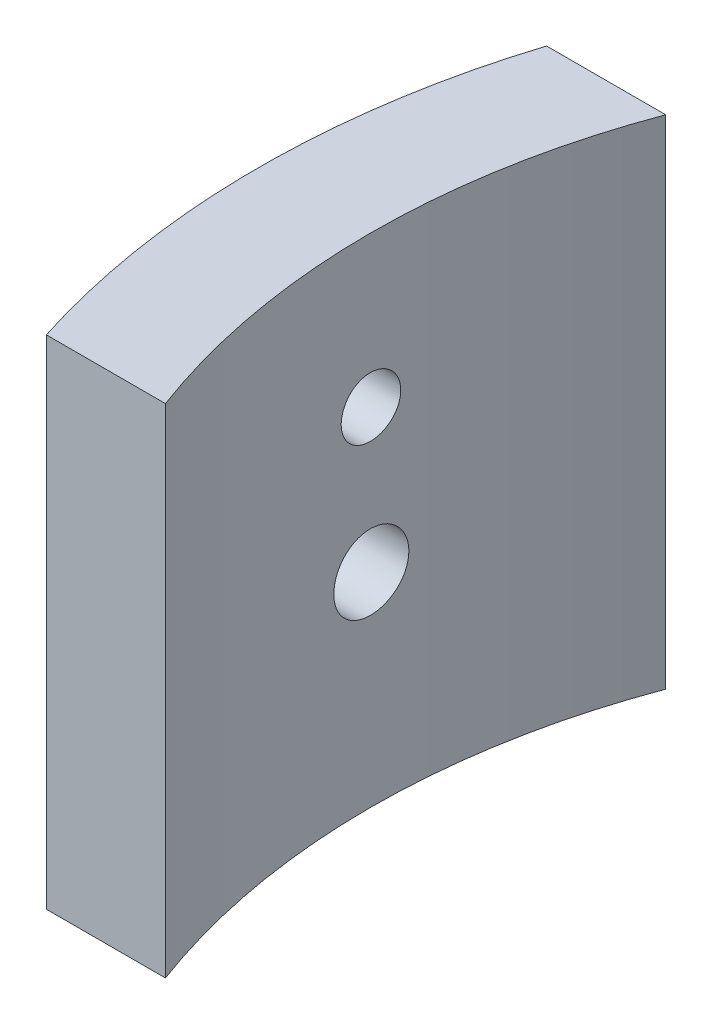
ISO-10303-21;
HEADER;
FILE_DESCRIPTION(('STEP AP214'),'2;1');
FILE_NAME('part.step','',(''),(''),'','','');
FILE_SCHEMA(('AUTOMOTIVE_DESIGN { 1 0 10303 214 1 1 1 1 }'));
ENDSEC;
DATA;
#1=APPLICATION_CONTEXT('core data for automotive mechanical design processes');
#2=APPLICATION_PROTOCOL_DEFINITION('international standard','automotive_design',2000,#1);
#3=PRODUCT_CONTEXT('',#1,'mechanical');
#4=PRODUCT('Part','Part','',(#3));
#5=PRODUCT_RELATED_PRODUCT_CATEGORY('part','',(#4));
#6=PRODUCT_DEFINITION_FORMATION('','',#4);
#7=PRODUCT_DEFINITION_CONTEXT('part definition',#1,'design');
#8=PRODUCT_DEFINITION('design','',#6,#7);
#9=PRODUCT_DEFINITION_SHAPE('','',#8);
#10=(LENGTH_UNIT() NAMED_UNIT(*) SI_UNIT(.MILLI.,.METRE.));
#11=(NAMED_UNIT(*) PLANE_ANGLE_UNIT() SI_UNIT($,.RADIAN.));
#12=(NAMED_UNIT(*) SI_UNIT($,.STERADIAN.) SOLID_ANGLE_UNIT());
#13=UNCERTAINTY_MEASURE_WITH_UNIT(LENGTH_MEASURE(1.E-05),#10,'distance_accuracy_value','');
#14=(GEOMETRIC_REPRESENTATION_CONTEXT(3) GLOBAL_UNCERTAINTY_ASSIGNED_CONTEXT((#13)) GLOBAL_UNIT_ASSIGNED_CONTEXT((#10,
#11,#12)) REPRESENTATION_CONTEXT('',''));
#15=CARTESIAN_POINT('',(0.,0.,0.));
#16=DIRECTION('',(0.,0.,1.));
#17=DIRECTION('',(1.,0.,0.));
#18=AXIS2_PLACEMENT_3D('',#15,#16,#17);
#19=CARTESIAN_POINT('',(0.,38.1,0.));
#20=DIRECTION('',(0.,-1.,0.));
#21=DIRECTION('',(0.,0.,-1.));
#22=AXIS2_PLACEMENT_3D('',#19,#20,#21);
#23=CYLINDRICAL_SURFACE('',#22,44.1043940806668);
#24=CARTESIAN_POINT('',(-44.0590237888081,22.4503977043266,-2.));
#25=CARTESIAN_POINT('',(-44.0590243990417,22.3381188090999,-1.99999504026224));
#26=CARTESIAN_POINT('',(-44.059457594174,22.2257599712269,-1.99051333666365));
#27=CARTESIAN_POINT('',(-44.0611439035289,22.0041409690323,-1.95282289828939));
#28=CARTESIAN_POINT('',(-44.0623979874924,21.8948846292606,-1.92459201395395));
#29=CARTESIAN_POINT('',(-44.0655837261527,21.6827131257266,-1.85021234894222));
#30=CARTESIAN_POINT('',(-44.0675150392582,21.5797947958113,-1.80407260016147));
#31=CARTESIAN_POINT('',(-44.07183718338,21.383192230565,-1.69519856298965));
#32=CARTESIAN_POINT('',(-44.0742279048652,21.2895058022224,-1.63246822875086));
#33=CARTESIAN_POINT('',(-44.0792018313536,21.1139179094863,-1.49213328396865));
#34=CARTESIAN_POINT('',(-44.081785178842,21.0320253028854,-1.41451759468417));
#35=CARTESIAN_POINT('',(-44.0868519077452,20.8824250479504,-1.24663689081444));
#36=CARTESIAN_POINT('',(-44.0893352851041,20.8147179746819,-1.15637136366641));
#37=CARTESIAN_POINT('',(-44.0939232379155,20.695387996913,-0.965709017333088));
#38=CARTESIAN_POINT('',(-44.0960276565927,20.643771742765,-0.865308031786972));
#39=CARTESIAN_POINT('',(-44.0996191363418,20.5581313546115,-0.657254173700705));
#40=CARTESIAN_POINT('',(-44.101106201476,20.5241071048492,-0.549601348883508));
#41=CARTESIAN_POINT('',(-44.103294457514,20.4746392636337,-0.33017890448785));
#42=CARTESIAN_POINT('',(-44.1039961934411,20.4591827854867,-0.21841219567996));
#43=CARTESIAN_POINT('',(-44.1045365332244,20.4472494824255,0.00613148555656997));
#44=CARTESIAN_POINT('',(-44.1043751429451,20.4507725285546,0.118908451115803));
#45=CARTESIAN_POINT('',(-44.1032078790649,20.4766875432299,0.342184063937902));
#46=CARTESIAN_POINT('',(-44.1022026265039,20.4990656354592,0.452684325483995));
#47=CARTESIAN_POINT('',(-44.0994616007306,20.5620340090446,0.668358242295614));
#48=CARTESIAN_POINT('',(-44.0977258248567,20.6026243567578,0.773531878151817));
#49=CARTESIAN_POINT('',(-44.0937182355526,20.7008808827919,0.975611752615507));
#50=CARTESIAN_POINT('',(-44.091446223388,20.7585533939594,1.07251490792658));
#51=CARTESIAN_POINT('',(-44.0866220771742,20.8893324984076,1.2552693773662));
#52=CARTESIAN_POINT('',(-44.0840699415177,20.9624391802526,1.34112062807221));
#53=CARTESIAN_POINT('',(-44.0789703028674,21.1220898667769,1.49941519997886));
#54=CARTESIAN_POINT('',(-44.0764228061129,21.2086459095705,1.57184638069112));
#55=CARTESIAN_POINT('',(-44.0716219560926,21.3926959778935,1.70115125204406));
#56=CARTESIAN_POINT('',(-44.0693686028951,21.4901900059653,1.75802493906852));
#57=CARTESIAN_POINT('',(-44.0654103171441,21.6933557433338,1.85459926051977));
#58=CARTESIAN_POINT('',(-44.0637053986152,21.7990276616728,1.89429945578845));
#59=CARTESIAN_POINT('',(-44.0610367907876,22.0155462965671,1.95539182542674));
#60=CARTESIAN_POINT('',(-44.0600730969019,22.1263929810957,1.9767841130885));
#61=CARTESIAN_POINT('',(-44.0589964552785,22.3500088997396,2.00063843719291));
#62=CARTESIAN_POINT('',(-44.0588827506357,22.4627763337251,2.00311731583438));
#63=CARTESIAN_POINT('',(-44.059516933974,22.687125609486,1.9891183904386));
#64=CARTESIAN_POINT('',(-44.0602648196199,22.7987074544738,1.97264063777987));
#65=CARTESIAN_POINT('',(-44.062537194939,23.0174709353795,1.92121015543386));
#66=CARTESIAN_POINT('',(-44.0640613611927,23.1246543837092,1.88626511948829));
#67=CARTESIAN_POINT('',(-44.0677142267263,23.3316343139471,1.79889981954337));
#68=CARTESIAN_POINT('',(-44.0698429288743,23.4314307608047,1.7464794726317));
#69=CARTESIAN_POINT('',(-44.0744667739158,23.6208813488044,1.62560829191931));
#70=CARTESIAN_POINT('',(-44.0769621751523,23.7105282600176,1.5571461361259));
#71=CARTESIAN_POINT('',(-44.082037236522,23.877062333708,1.40615128962696));
#72=CARTESIAN_POINT('',(-44.0846168971038,23.9539494282295,1.32361852398954));
#73=CARTESIAN_POINT('',(-44.0895719198985,24.0928378223479,1.14675297379224));
#74=CARTESIAN_POINT('',(-44.0919471320754,24.1548282487014,1.05241164595836));
#75=CARTESIAN_POINT('',(-44.0962234115755,24.2620893052479,0.854650245895033));
#76=CARTESIAN_POINT('',(-44.0981244806878,24.3073599985366,0.751230207927943));
#77=CARTESIAN_POINT('',(-44.1012374923982,24.3798774816934,0.538287702199877));
#78=CARTESIAN_POINT('',(-44.1024497018401,24.4071312514542,0.428767615493967));
#79=CARTESIAN_POINT('',(-44.1040494306891,24.4428641173537,0.206700459798727));
#80=CARTESIAN_POINT('',(-44.1044369536586,24.4513432945917,0.0941534038869088));
#81=CARTESIAN_POINT('',(-44.1043436513105,24.4492854762555,-0.130664836209696));
#82=CARTESIAN_POINT('',(-44.1038636055085,24.438765551491,-0.242936177373259));
#83=CARTESIAN_POINT('',(-44.1020907543579,24.3990434008602,-0.464117113927691));
#84=CARTESIAN_POINT('',(-44.1007979474527,24.3698411392127,-0.57302670287954));
#85=CARTESIAN_POINT('',(-44.097545068798,24.2935865821962,-0.784396620558011));
#86=CARTESIAN_POINT('',(-44.0955849899102,24.246534095867,-0.886856880276511));
#87=CARTESIAN_POINT('',(-44.0912181191504,24.1359180591273,-1.08242377536315));
#88=CARTESIAN_POINT('',(-44.0888113416667,24.0723550404986,-1.17553071185518));
#89=CARTESIAN_POINT('',(-44.0838196151823,23.9304624413345,-1.34983244348865));
#90=CARTESIAN_POINT('',(-44.081234526927,23.8521212347809,-1.43101776984483));
#91=CARTESIAN_POINT('',(-44.0761783607003,23.6828985642765,-1.57910878244087));
#92=CARTESIAN_POINT('',(-44.0737073109857,23.5920140143324,-1.64601094429745));
#93=CARTESIAN_POINT('',(-44.0691564797967,23.4002230850397,-1.76366230597344));
#94=CARTESIAN_POINT('',(-44.067077041602,23.299308030403,-1.81439736069738));
#95=CARTESIAN_POINT('',(-44.0635495597143,23.0904589145261,-1.8981440618847));
#96=CARTESIAN_POINT('',(-44.0621007686351,22.9825333368893,-1.93117669845201));
#97=CARTESIAN_POINT('',(-44.0603825821113,22.8033446641878,-1.96989147622607));
#98=CARTESIAN_POINT('',(-44.0598752725266,22.7332429141104,-1.9811678156445));
#99=CARTESIAN_POINT('',(-44.0591956832243,22.592237313413,-1.9962236416578));
#100=CARTESIAN_POINT('',(-44.0590234032736,22.5213334633516,-2.0000031334719));
#101=CARTESIAN_POINT('',(-44.0590237888081,22.4503977043266,-2.));
#102=B_SPLINE_CURVE_WITH_KNOTS('',3,(#24,#25,#26,#27,#28,#29,#30,#31,#32,#33,#34,#35,#36,#37,
#38,#39,#40,#41,#42,#43,#44,#45,#46,#47,#48,#49,#50,#51,#52,#53,#54,#55,#56,#57,#58,#59,#60,#61,
#62,#63,#64,#65,#66,#67,#68,#69,#70,#71,#72,#73,#74,#75,#76,#77,#78,#79,#80,#81,#82,#83,#84,#85,
#86,#87,#88,#89,#90,#91,#92,#93,#94,#95,#96,#97,#98,#99,#100,#101),.UNSPECIFIED.,.T.,.F.,(4,2,2,
2,2,2,2,2,2,2,2,2,2,2,2,2,2,2,2,2,2,2,2,2,2,2,2,2,2,2,2,2,2,2,2,2,2,2,4),(0.,0.336577747932862,
0.67355382481844,1.01036017645689,1.34708632686833,1.68406407233082,2.02105547585109,
2.35818597417798,2.69531425413082,3.03220841963958,3.36910029611725,3.70574445432932,
4.04238983912761,4.37916018454449,4.71593246246813,5.05300793010627,5.39008347609496,
5.72716764122258,6.06424972040629,6.40103159634617,6.73781255950191,7.0744533252401,
7.41109568820666,7.74797636621007,8.08485883830001,8.42198646279997,8.75911281506109,
9.09610848536475,9.43310269996922,9.76979427383375,10.1064864925492,10.4431823132749,
10.7798672908313,11.1168182519089,11.4538522600797,11.7911803450558,12.1281075635474,
12.3407513965148,12.5533950814416),.UNSPECIFIED.);
#103=CARTESIAN_POINT('',(-44.0590237888081,22.4503977043266,-2.));
#104=VERTEX_POINT('',#103);
#105=EDGE_CURVE('E134',#104,#104,#102,.T.);
#106=ORIENTED_EDGE('',*,*,#105,.F.);
#107=EDGE_LOOP('',(#106));
#108=FACE_BOUND('',#107,.T.);
#109=CARTESIAN_POINT('',(-43.8465069415199,30.0703977043267,-4.76250000000001));
#110=CARTESIAN_POINT('',(-43.8465065309564,29.9370150287803,-4.76250137530376));
#111=CARTESIAN_POINT('',(-43.8471168179167,29.8036530968397,-4.75689447266601));
#112=CARTESIAN_POINT('',(-43.8495397569245,29.5378360452066,-4.7345087160224));
#113=CARTESIAN_POINT('',(-43.8513527150719,29.4053811650472,-4.71772701784067));
#114=CARTESIAN_POINT('',(-43.8561315531644,29.1422686790484,-4.67309361852635));
#115=CARTESIAN_POINT('',(-43.8590983240271,29.0116125430267,-4.64523336270208));
#116=CARTESIAN_POINT('',(-43.8661007232562,28.7530801753742,-4.57863572826138));
#117=CARTESIAN_POINT('',(-43.8701367429708,28.6252049801565,-4.53989436681544));
#118=CARTESIAN_POINT('',(-43.8791570871768,28.3733167596648,-4.45186526115511));
#119=CARTESIAN_POINT('',(-43.8841404588819,28.2492999984162,-4.40258810701371));
#120=CARTESIAN_POINT('',(-43.8949182415999,28.0058214078066,-4.29379979539951));
#121=CARTESIAN_POINT('',(-43.9007129511288,27.8863612756469,-4.23428486928769));
#122=CARTESIAN_POINT('',(-43.9129441493275,27.6529463891225,-4.10549543647735));
#123=CARTESIAN_POINT('',(-43.9193802736525,27.5389885632662,-4.03622646127171));
#124=CARTESIAN_POINT('',(-43.9327178083424,27.3172582819339,-3.88836636631439));
#125=CARTESIAN_POINT('',(-43.9396193903087,27.2094881350918,-3.80977180027824));
#126=CARTESIAN_POINT('',(-43.9537152704963,27.000574262673,-3.64355169707933));
#127=CARTESIAN_POINT('',(-43.9609104809707,26.8994542169924,-3.55589647375968));
#128=CARTESIAN_POINT('',(-43.9753708796073,26.7049128368333,-3.3723593936946));
#129=CARTESIAN_POINT('',(-43.9826360926568,26.6114943623936,-3.27647450753875));
#130=CARTESIAN_POINT('',(-43.9970264194929,26.4330815033402,-3.07720892817069));
#131=CARTESIAN_POINT('',(-44.0041515775141,26.3480844235171,-2.97383065162746));
#132=CARTESIAN_POINT('',(-44.0180658698236,26.1870499056262,-2.76023810872376));
#133=CARTESIAN_POINT('',(-44.0248548791661,26.1110157847915,-2.65002133429486));
#134=CARTESIAN_POINT('',(-44.0379160898569,25.9683314347992,-2.42330874870627));
#135=CARTESIAN_POINT('',(-44.0441871811712,25.9017011545542,-2.30680029312634));
#136=CARTESIAN_POINT('',(-44.0560210596333,25.7784791364571,-2.06854161979116));
#137=CARTESIAN_POINT('',(-44.0615835834177,25.7218911281059,-1.94678947540698));
#138=CARTESIAN_POINT('',(-44.0769555718001,25.5679065931107,-1.57503550207831));
#139=CARTESIAN_POINT('',(-44.0854646561081,25.4861295931305,-1.31828152562882));
#140=CARTESIAN_POINT('',(-44.0979875908934,25.3672244982917,-0.795733386354938));
#141=CARTESIAN_POINT('',(-44.1020189278895,25.3299226765287,-0.529978596352507));
#142=CARTESIAN_POINT('',(-44.1052015505222,25.300401627345,0.00408472100752453));
#143=CARTESIAN_POINT('',(-44.1043529820606,25.3081810520641,0.27239317177512));
#144=CARTESIAN_POINT('',(-44.0978829888639,25.3684848881474,0.80272518197026));
#145=CARTESIAN_POINT('',(-44.0922814625503,25.4208227571155,1.06477026759159));
#146=CARTESIAN_POINT('',(-44.0769583895802,25.568460634289,1.57633798427704));
#147=CARTESIAN_POINT('',(-44.067236781878,25.6637612790588,1.82586042973673));
#148=CARTESIAN_POINT('',(-44.0447318585004,25.894823832352,2.30588154216014));
#149=CARTESIAN_POINT('',(-44.0319423482658,26.0306677411457,2.53634043427181));
#150=CARTESIAN_POINT('',(-44.0047355341011,26.3389006962968,2.97125943883504));
#151=CARTESIAN_POINT('',(-43.9903181744672,26.5112909934201,3.175718661089));
#152=CARTESIAN_POINT('',(-43.9613854476045,26.8887710586733,3.55392773642759));
#153=CARTESIAN_POINT('',(-43.9468699556355,27.0940231751736,3.72751558491278));
#154=CARTESIAN_POINT('',(-43.9194501089016,27.5308391547976,4.03779878551054));
#155=CARTESIAN_POINT('',(-43.906545757158,27.7624030672614,4.17449406844027));
#156=CARTESIAN_POINT('',(-43.8838085631316,28.245399750536,4.40711401205456));
#157=CARTESIAN_POINT('',(-43.8739765408893,28.4968378035863,4.5030277901407));
#158=CARTESIAN_POINT('',(-43.8585139364762,29.0123798742716,4.65122934231966));
#159=CARTESIAN_POINT('',(-43.8528832045198,29.276483439995,4.70351867173077));
#160=CARTESIAN_POINT('',(-43.8464871377051,29.8084348514969,4.76277681931969));
#161=CARTESIAN_POINT('',(-43.845697429279,30.0762571241172,4.76997267802839));
#162=CARTESIAN_POINT('',(-43.8490084674653,30.6092935394765,4.73943669964974));
#163=CARTESIAN_POINT('',(-43.8531091368011,30.874507723361,4.70170557248704));
#164=CARTESIAN_POINT('',(-43.8657166998315,31.3941322398574,4.58257700429528));
#165=CARTESIAN_POINT('',(-43.8742126821357,31.6485676463672,4.50128767895934));
#166=CARTESIAN_POINT('',(-43.8946447461755,32.1401929886849,4.2974607949564));
#167=CARTESIAN_POINT('',(-43.9065809193113,32.3773824660874,4.17492214034845));
#168=CARTESIAN_POINT('',(-43.9326072998264,32.8288156418182,3.89150963651744));
#169=CARTESIAN_POINT('',(-43.9467058556715,33.0429646870236,3.73048579868569));
#170=CARTESIAN_POINT('',(-43.9754414510301,33.4412764009661,3.37488695110257));
#171=CARTESIAN_POINT('',(-43.9900785060975,33.6254382027274,3.18031097164373));
#172=CARTESIAN_POINT('',(-44.0183159443298,33.9593353768408,2.76214771739266));
#173=CARTESIAN_POINT('',(-44.0319116962205,34.1089223185423,2.53844157777638));
#174=CARTESIAN_POINT('',(-44.0564663714723,34.3683991459452,2.06893927483715));
#175=CARTESIAN_POINT('',(-44.0674253361203,34.4782896532274,1.82314345747734));
#176=CARTESIAN_POINT('',(-44.0854521521882,34.6550096038396,1.31699979732673));
#177=CARTESIAN_POINT('',(-44.0925279958029,34.7219275415176,1.05668306788743));
#178=CARTESIAN_POINT('',(-44.1020194342149,34.8110727459242,0.52828144980144));
#179=CARTESIAN_POINT('',(-44.1044351832915,34.833301492156,0.26019681862097));
#180=CARTESIAN_POINT('',(-44.1043726378466,34.8326876008119,-0.140920832053926));
#181=CARTESIAN_POINT('',(-44.1037423916554,34.8268692204749,-0.274190444524194));
#182=CARTESIAN_POINT('',(-44.1012904097247,34.8040857010611,-0.539749015039673));
#183=CARTESIAN_POINT('',(-44.0994691166989,34.7871247037,-0.672038318996618));
#184=CARTESIAN_POINT('',(-44.0946834637565,34.7421671492332,-0.934747144404359));
#185=CARTESIAN_POINT('',(-44.0917186862589,34.714166560574,-1.06516596471962));
#186=CARTESIAN_POINT('',(-44.0847315376241,34.6473495462274,-1.32312522594033));
#187=CARTESIAN_POINT('',(-44.0807095527169,34.6085370701408,-1.45066669958862));
#188=CARTESIAN_POINT('',(-44.0717195339658,34.520365480226,-1.70203928257204));
#189=CARTESIAN_POINT('',(-44.0667513402263,34.4710045836933,-1.82586976070286));
#190=CARTESIAN_POINT('',(-44.0560106940831,34.3621152934671,-2.06888573055336));
#191=CARTESIAN_POINT('',(-44.0502385351469,34.3025906080297,-2.18807289697448));
#192=CARTESIAN_POINT('',(-44.0380478605366,34.1737621427409,-2.42106029687361));
#193=CARTESIAN_POINT('',(-44.0316291143218,34.1044548713523,-2.53485858753741));
#194=CARTESIAN_POINT('',(-44.0183288466899,33.9565938821527,-2.75619158757575));
#195=CARTESIAN_POINT('',(-44.0114474933857,33.8780435156085,-2.86372854611024));
#196=CARTESIAN_POINT('',(-43.9973750342046,33.7117893452683,-3.07238689448243));
#197=CARTESIAN_POINT('',(-43.9901824886156,33.6240395394792,-3.17347153756734));
#198=CARTESIAN_POINT('',(-43.9757272960609,33.440382112466,-3.36786048622292));
#199=CARTESIAN_POINT('',(-43.9684646755814,33.3444774740994,-3.4611676121174));
#200=CARTESIAN_POINT('',(-43.9540673317082,33.1450934603586,-3.63944322987124));
#201=CARTESIAN_POINT('',(-43.946932688681,33.04160951934,-3.72440662227088));
#202=CARTESIAN_POINT('',(-43.9330004526485,32.8278825155519,-3.88530164854122));
#203=CARTESIAN_POINT('',(-43.9262027361644,32.7176419626135,-3.96123660569383));
#204=CARTESIAN_POINT('',(-43.9131128759782,32.4907646621539,-4.10380783026348));
#205=CARTESIAN_POINT('',(-43.9068224742335,32.374108012447,-4.17041259326118));
#206=CARTESIAN_POINT('',(-43.8949548502452,32.1356023012217,-4.29352310797116));
#207=CARTESIAN_POINT('',(-43.8893773676879,32.0137551567416,-4.35003254888246));
#208=CARTESIAN_POINT('',(-43.879097532248,31.7657903654982,-4.45253086336384));
#209=CARTESIAN_POINT('',(-43.874394472304,31.6396762674113,-4.49852824398447));
#210=CARTESIAN_POINT('',(-43.8659944258131,31.3840274118278,-4.57971304503142));
#211=CARTESIAN_POINT('',(-43.8622971949783,31.2544934933098,-4.61490309052632));
#212=CARTESIAN_POINT('',(-43.8550121215894,30.9510997604901,-4.68370215146596));
#213=CARTESIAN_POINT('',(-43.8518357674765,30.7762870716127,-4.71322234210733));
#214=CARTESIAN_POINT('',(-43.8475834552235,30.424436639344,-4.75262030363653));
#215=CARTESIAN_POINT('',(-43.8465074863451,30.2473989073331,-4.76249817494725));
#216=CARTESIAN_POINT('',(-43.8465069415199,30.0703977043267,-4.76250000000001));
#217=B_SPLINE_CURVE_WITH_KNOTS('',3,(#109,#110,#111,#112,#113,#114,#115,#116,#117,#118,#119,
#120,#121,#122,#123,#124,#125,#126,#127,#128,#129,#130,#131,#132,#133,#134,#135,#136,#137,#138,
#139,#140,#141,#142,#143,#144,#145,#146,#147,#148,#149,#150,#151,#152,#153,#154,#155,#156,#157,
#158,#159,#160,#161,#162,#163,#164,#165,#166,#167,#168,#169,#170,#171,#172,#173,#174,#175,#176,
#177,#178,#179,#180,#181,#182,#183,#184,#185,#186,#187,#188,#189,#190,#191,#192,#193,#194,#195,
#196,#197,#198,#199,#200,#201,#202,#203,#204,#205,#206,#207,#208,#209,#210,#211,#212,#213,#214,
#215,#216),.UNSPECIFIED.,.T.,.F.,(4,2,2,2,2,2,2,2,2,2,2,2,2,2,2,2,2,2,2,2,2,2,2,2,2,2,2,2,2,2,2,
2,2,2,2,2,2,2,2,2,2,2,2,2,2,2,2,2,2,2,2,2,2,4),(0.,0.399993199746715,0.800088243509987,
1.20049283632047,1.60104418133331,2.00119478841494,2.4014930118868,2.80156513484235,
3.20178556817314,3.60336154229045,4.0050859792711,4.40668142896124,4.80842504742618,
5.21100849450729,5.61374114164236,6.418314678968,7.21973502272083,8.02113140535562,
8.81918917485551,9.6172587692858,10.4169535557711,11.2166757154812,12.0204781367007,
12.8242820652414,13.6283003555071,14.4322899793289,15.2322283320961,16.0321540446113,
16.8301033987795,17.6280739550963,18.4292066711194,19.2303625449679,20.0348964351511,
20.8394177271156,21.6422768924107,22.4451094774008,22.8449146169346,23.2445712327353,
23.6443739347077,24.0440307791661,24.4437552199373,24.843334131751,25.2430560210162,
25.6426334271957,26.0443139643997,26.4458482026239,26.8476263398313,27.2492561254135,
27.6522109536958,28.0550182250135,28.4574983546783,28.8598806456919,29.3906815104158,
29.9214796613717),.UNSPECIFIED.);
#218=CARTESIAN_POINT('',(-43.8465069415199,30.0703977043267,-4.76250000000001));
#219=VERTEX_POINT('',#218);
#220=EDGE_CURVE('E11',#219,#219,#217,.T.);
#221=ORIENTED_EDGE('',*,*,#220,.F.);
#222=EDGE_LOOP('',(#221));
#223=FACE_BOUND('',#222,.T.);
#224=CARTESIAN_POINT('',(0.,11.5791977043266,0.));
#225=DIRECTION('',(0.,-1.,0.));
#226=DIRECTION('',(0.,0.,-1.));
#227=AXIS2_PLACEMENT_3D('',#224,#225,#226);
#228=CIRCLE('',#227,44.1043940806668);
#229=CARTESIAN_POINT('',(-42.0401635608469,11.5791977043266,-13.335));
#230=VERTEX_POINT('',#229);
#231=CARTESIAN_POINT('',(-42.0401635608469,11.5791977043266,13.335));
#232=VERTEX_POINT('',#231);
#233=EDGE_CURVE('E81',#230,#232,#228,.F.);
#234=ORIENTED_EDGE('',*,*,#233,.T.);
#235=DIRECTION('',(0.,-1.,0.));
#236=VECTOR('',#235,1.);
#237=CARTESIAN_POINT('',(-42.0401635608469,38.1,13.335));
#238=LINE('',#237,#236);
#239=CARTESIAN_POINT('',(-42.0401635608469,38.1,13.335));
#240=VERTEX_POINT('',#239);
#241=EDGE_CURVE('E100',#240,#232,#238,.T.);
#242=ORIENTED_EDGE('',*,*,#241,.F.);
#243=CARTESIAN_POINT('',(0.,38.1,0.));
#244=DIRECTION('',(0.,1.,0.));
#245=DIRECTION('',(0.,0.,1.));
#246=AXIS2_PLACEMENT_3D('',#243,#244,#245);
#247=CIRCLE('',#246,44.1043940806668);
#248=CARTESIAN_POINT('',(-42.0401635608469,38.1,-13.335));
#249=VERTEX_POINT('',#248);
#250=EDGE_CURVE('E144',#249,#240,#247,.T.);
#251=ORIENTED_EDGE('',*,*,#250,.F.);
#252=DIRECTION('',(0.,-1.,0.));
#253=VECTOR('',#252,1.);
#254=CARTESIAN_POINT('',(-42.0401635608469,38.1,-13.335));
#255=LINE('',#254,#253);
#256=EDGE_CURVE('E98',#249,#230,#255,.T.);
#257=ORIENTED_EDGE('',*,*,#256,.T.);
#258=EDGE_LOOP('',(#234,#242,#251,#257));
#259=FACE_BOUND('',#258,.T.);
#260=ADVANCED_FACE('F33',(#108,#223,#259),#23,.T.);
#261=CARTESIAN_POINT('',(0.,38.1,0.));
#262=DIRECTION('',(0.,-1.,0.));
#263=DIRECTION('',(0.,0.,-1.));
#264=AXIS2_PLACEMENT_3D('',#261,#262,#263);
#265=CYLINDRICAL_SURFACE('',#264,38.1);
#266=CARTESIAN_POINT('',(-38.0474703495515,22.4503977043266,-2.));
#267=CARTESIAN_POINT('',(-38.0474710546729,22.3381398928542,-1.99999504824444));
#268=CARTESIAN_POINT('',(-38.0479725095062,22.2258026541177,-1.99051689069613));
#269=CARTESIAN_POINT('',(-38.0499244771662,22.0042277024951,-1.95284136009362));
#270=CARTESIAN_POINT('',(-38.051376105727,21.8949937912012,-1.92462197973472));
#271=CARTESIAN_POINT('',(-38.055063538444,21.6828672604536,-1.8502746673313));
#272=CARTESIAN_POINT('',(-38.0572989402149,21.5799714188745,-1.80415592343538));
#273=CARTESIAN_POINT('',(-38.0623015276112,21.3834093793409,-1.69533327170802));
#274=CARTESIAN_POINT('',(-38.0650685883528,21.2897410217004,-1.63263325742965));
#275=CARTESIAN_POINT('',(-38.0708261770562,21.1141619656379,-1.4923512620149));
#276=CARTESIAN_POINT('',(-38.0738169182536,21.0322627096855,-1.41475496691442));
#277=CARTESIAN_POINT('',(-38.0796828664911,20.8826443128529,-1.24691190662659));
#278=CARTESIAN_POINT('',(-38.0825580687929,20.8149257530672,-1.15666462328164));
#279=CARTESIAN_POINT('',(-38.0878706264306,20.6955588098804,-0.96602055667337));
#280=CARTESIAN_POINT('',(-38.090307735729,20.6439194448768,-0.865618119322093));
#281=CARTESIAN_POINT('',(-38.0944673048082,20.5582345950313,-0.657553579932413));
#282=CARTESIAN_POINT('',(-38.0961897704042,20.5241889670243,-0.549891536975494));
#283=CARTESIAN_POINT('',(-38.098724517484,20.4746885379384,-0.330470140885562));
#284=CARTESIAN_POINT('',(-38.0995376446182,20.4592164631692,-0.218714694538213));
#285=CARTESIAN_POINT('',(-38.1001649240089,20.4472490208093,0.0058098969147796));
#286=CARTESIAN_POINT('',(-38.0999790847449,20.4507534921395,0.118579033407781));
#287=CARTESIAN_POINT('',(-38.0986300839424,20.4766253451285,0.341812932397962));
#288=CARTESIAN_POINT('',(-38.0974678856047,20.4989741365095,0.452279856054684));
#289=CARTESIAN_POINT('',(-38.094298171997,20.56187140597,0.667892017040105));
#290=CARTESIAN_POINT('',(-38.0922906529168,20.6024199660827,0.773037230379495));
#291=CARTESIAN_POINT('',(-38.0876547545013,20.700586918217,0.975081111500118));
#292=CARTESIAN_POINT('',(-38.0850260675225,20.7582137721488,1.07197566055338));
#293=CARTESIAN_POINT('',(-38.0794438291461,20.8888953218584,1.25472272253966));
#294=CARTESIAN_POINT('',(-38.0764902752068,20.9619501383447,1.34057514907064));
#295=CARTESIAN_POINT('',(-38.0705866727919,21.1215189319606,1.49890936775545));
#296=CARTESIAN_POINT('',(-38.0676366328434,21.2080490390792,1.57137490546291));
#297=CARTESIAN_POINT('',(-38.062076216131,21.3920555049101,1.7007530787779));
#298=CARTESIAN_POINT('',(-38.0594658394647,21.4895318667607,1.7576657099263));
#299=CARTESIAN_POINT('',(-38.0548793976098,21.6926737514849,1.85432115775649));
#300=CARTESIAN_POINT('',(-38.0529033554951,21.7983395720751,1.8940633498848));
#301=CARTESIAN_POINT('',(-38.049809293279,22.0148564234814,1.95523886176806));
#302=CARTESIAN_POINT('',(-38.0486912660644,22.1257074113037,1.97667233330474));
#303=CARTESIAN_POINT('',(-38.0474406331002,22.3493063159587,2.000601856092));
#304=CARTESIAN_POINT('',(-38.0473068530827,22.4620518114339,2.00312047400902));
#305=CARTESIAN_POINT('',(-38.0480367349632,22.6863637951514,1.98920769857108));
#306=CARTESIAN_POINT('',(-38.0489003932195,22.7979302876968,1.97277637440304));
#307=CARTESIAN_POINT('',(-38.0515267397444,23.0166538357239,1.92144886157481));
#308=CARTESIAN_POINT('',(-38.0532889245172,23.1238133243994,1.88656301363006));
#309=CARTESIAN_POINT('',(-38.0575132873922,23.3307559816728,1.79932720118943));
#310=CARTESIAN_POINT('',(-38.0599754699645,23.4305391031615,1.74697712516994));
#311=CARTESIAN_POINT('',(-38.0653251822079,23.6200003409396,1.62624101088177));
#312=CARTESIAN_POINT('',(-38.0682131128087,23.7096687901279,1.55783982084904));
#313=CARTESIAN_POINT('',(-38.0740874227916,23.8762580573593,1.4069652581044));
#314=CARTESIAN_POINT('',(-38.0770738028636,23.9531787860423,1.32449178675554));
#315=CARTESIAN_POINT('',(-38.0828118626823,24.0921650198325,1.14771681877244));
#316=CARTESIAN_POINT('',(-38.085563310365,24.1542159434988,1.05340384918466));
#317=CARTESIAN_POINT('',(-38.0905181043043,24.2616014693391,0.8556850199097));
#318=CARTESIAN_POINT('',(-38.0927214531285,24.3069361498187,0.752279202819871));
#319=CARTESIAN_POINT('',(-38.0963306314498,24.3795768311481,0.539364117196039));
#320=CARTESIAN_POINT('',(-38.0977368727362,24.4068921420775,0.429858032258736));
#321=CARTESIAN_POINT('',(-38.099594997294,24.4427491879716,0.207806369349576));
#322=CARTESIAN_POINT('',(-38.1000468866774,24.4512910431672,0.0952608108481036));
#323=CARTESIAN_POINT('',(-38.0999454073661,24.4493575644636,-0.129530397813828));
#324=CARTESIAN_POINT('',(-38.0993932471833,24.4389050928626,-0.241776245882445));
#325=CARTESIAN_POINT('',(-38.0973482007726,24.3993269547847,-0.462917101544321));
#326=CARTESIAN_POINT('',(-38.0958553127914,24.3702012535074,-0.57181210289234));
#327=CARTESIAN_POINT('',(-38.0920967402758,24.2941082099057,-0.783164634778036));
#328=CARTESIAN_POINT('',(-38.0898310517601,24.2471407756647,-0.885622132147968));
#329=CARTESIAN_POINT('',(-38.0847816081437,24.1367012707073,-1.08119919158479));
#330=CARTESIAN_POINT('',(-38.0819978684971,24.0732296923096,-1.17431903207927));
#331=CARTESIAN_POINT('',(-38.0762217464145,23.9315011036121,-1.34869209117096));
#332=CARTESIAN_POINT('',(-38.0732291392658,23.8532280092628,-1.42993222880055));
#333=CARTESIAN_POINT('',(-38.067374161198,23.6841316313192,-1.57814507251643));
#334=CARTESIAN_POINT('',(-38.0645118224714,23.5933052676658,-1.64511426681492));
#335=CARTESIAN_POINT('',(-38.0592381499375,23.4016032846842,-1.76291891456049));
#336=CARTESIAN_POINT('',(-38.056827274757,23.3007176041124,-1.8137379977749));
#337=CARTESIAN_POINT('',(-38.0527355823806,23.0919083211784,-1.89765550865305));
#338=CARTESIAN_POINT('',(-38.051053904616,22.9839931887192,-1.93077483563256));
#339=CARTESIAN_POINT('',(-38.0490548295057,22.8045741257051,-1.96967976640888));
#340=CARTESIAN_POINT('',(-38.0484632762815,22.7342319152208,-1.98103530385916));
#341=CARTESIAN_POINT('',(-38.0476708129232,22.5927363503133,-1.99619698707609));
#342=CARTESIAN_POINT('',(-38.0474699024176,22.5215829966616,-2.00000314002351));
#343=CARTESIAN_POINT('',(-38.0474703495515,22.4503977043266,-2.));
#344=B_SPLINE_CURVE_WITH_KNOTS('',3,(#266,#267,#268,#269,#270,#271,#272,#273,#274,#275,#276,
#277,#278,#279,#280,#281,#282,#283,#284,#285,#286,#287,#288,#289,#290,#291,#292,#293,#294,#295,
#296,#297,#298,#299,#300,#301,#302,#303,#304,#305,#306,#307,#308,#309,#310,#311,#312,#313,#314,
#315,#316,#317,#318,#319,#320,#321,#322,#323,#324,#325,#326,#327,#328,#329,#330,#331,#332,#333,
#334,#335,#336,#337,#338,#339,#340,#341,#342,#343),.UNSPECIFIED.,.T.,.F.,(4,2,2,2,2,2,2,2,2,2,2,
2,2,2,2,2,2,2,2,2,2,2,2,2,2,2,2,2,2,2,2,2,2,2,2,2,2,2,4),(0.,0.336513577634117,
0.673423014300267,1.01015973597308,1.34681745646646,1.68380030833229,2.02079696633465,
2.35798229784572,2.69516488554302,3.03203364469974,3.36889954440981,3.70543350783239,
4.04196898815413,4.37867149380354,4.71537663391154,5.05248795435351,5.38959937144797,
5.72672304952114,6.06384393276688,6.40056254459731,6.73727992705989,7.07380883453105,
7.41033989106013,7.74718990974849,8.08404228961928,8.42122365000224,8.75840343087267,
9.09540886411218,9.43241213906009,9.76901005261785,10.1056085934819,10.4422088684495,
10.7787991037801,11.1157572184167,11.4527981560576,11.7901796467296,12.127161882813,
12.3405531815528,12.5539442773203),.UNSPECIFIED.);
#345=CARTESIAN_POINT('',(-38.0474703495515,22.4503977043266,-2.));
#346=VERTEX_POINT('',#345);
#347=EDGE_CURVE('E38',#346,#346,#344,.T.);
#348=ORIENTED_EDGE('',*,*,#347,.T.);
#349=EDGE_LOOP('',(#348));
#350=FACE_BOUND('',#349,.T.);
#351=CARTESIAN_POINT('',(-38.0669127162947,30.0703977043267,1.58749999999999));
#352=CARTESIAN_POINT('',(-38.066913161719,30.1595267409628,1.58749606037634));
#353=CARTESIAN_POINT('',(-38.0672291070234,30.2487194194017,1.57996866899218));
#354=CARTESIAN_POINT('',(-38.0684590117711,30.4246455138595,1.55004646401668));
#355=CARTESIAN_POINT('',(-38.0693736804485,30.5113758857963,1.52763401747016));
#356=CARTESIAN_POINT('',(-38.0716972419605,30.6798033631817,1.46858339678575));
#357=CARTESIAN_POINT('',(-38.0731058876714,30.7615029614136,1.43195233487162));
#358=CARTESIAN_POINT('',(-38.0762583633807,30.9175709765776,1.3455148865344));
#359=CARTESIAN_POINT('',(-38.0780021129431,30.9919411463475,1.29571166078958));
#360=CARTESIAN_POINT('',(-38.0816298088072,31.1313172430355,1.18430155143168));
#361=CARTESIAN_POINT('',(-38.0835138450982,31.196317079323,1.12268705066604));
#362=CARTESIAN_POINT('',(-38.0872089556512,31.3150556813008,0.989418064698524));
#363=CARTESIAN_POINT('',(-38.0890200269674,31.3687939927113,0.917763174670881));
#364=CARTESIAN_POINT('',(-38.0923657097258,31.4634987258169,0.766418297681569));
#365=CARTESIAN_POINT('',(-38.0939002254484,31.5044607290327,0.686725543535977));
#366=CARTESIAN_POINT('',(-38.096518998899,31.5724216299967,0.521586675980106));
#367=CARTESIAN_POINT('',(-38.0976032592688,31.5994206096729,0.436140596330756));
#368=CARTESIAN_POINT('',(-38.0991987505247,31.6386738667163,0.26197364055883));
#369=CARTESIAN_POINT('',(-38.0997103169098,31.6509367771627,0.173254713257239));
#370=CARTESIAN_POINT('',(-38.1001038882216,31.6603964244356,-0.0049837903148148));
#371=CARTESIAN_POINT('',(-38.099985896937,31.6575932519318,-0.0945033617636603));
#372=CARTESIAN_POINT('',(-38.0991339351806,31.6370075077681,-0.271743564088213));
#373=CARTESIAN_POINT('',(-38.0984003471315,31.619234235853,-0.359465277184465));
#374=CARTESIAN_POINT('',(-38.096400284615,31.5692272159596,-0.530678918647964));
#375=CARTESIAN_POINT('',(-38.0951338084183,31.5369934210542,-0.614170833287725));
#376=CARTESIAN_POINT('',(-38.0922100077487,31.4589697161659,-0.774584812084734));
#377=CARTESIAN_POINT('',(-38.0905525607966,31.4131755569785,-0.851504807150051));
#378=CARTESIAN_POINT('',(-38.0870335379558,31.3093341714161,-0.996568830788555));
#379=CARTESIAN_POINT('',(-38.0851719610908,31.251286886442,-1.06471281738894));
#380=CARTESIAN_POINT('',(-38.0814527223519,31.1245343958996,-1.19034468707978));
#381=CARTESIAN_POINT('',(-38.0795950645294,31.0558211227241,-1.24782443103578));
#382=CARTESIAN_POINT('',(-38.0760945176802,30.9097155645421,-1.35043349806333));
#383=CARTESIAN_POINT('',(-38.074451628699,30.8323232777048,-1.39556281852975));
#384=CARTESIAN_POINT('',(-38.0715659848354,30.6710518168258,-1.47218919300052));
#385=CARTESIAN_POINT('',(-38.0703232383478,30.587172506735,-1.50368596100499));
#386=CARTESIAN_POINT('',(-38.0683783526477,30.4153101718399,-1.55214781210117));
#387=CARTESIAN_POINT('',(-38.067676210609,30.3273271684911,-1.56911297115972));
#388=CARTESIAN_POINT('',(-38.0668922285278,30.1498258192699,-1.58801999776023));
#389=CARTESIAN_POINT('',(-38.0668099224472,30.0603086776435,-1.58997315244738));
#390=CARTESIAN_POINT('',(-38.0672736772174,29.8822178525079,-1.57883016297279));
#391=CARTESIAN_POINT('',(-38.0678197366355,29.7936441668481,-1.56573405312523));
#392=CARTESIAN_POINT('',(-38.0694782459643,29.6199861374538,-1.52487363986102));
#393=CARTESIAN_POINT('',(-38.0705904970582,29.5349005801963,-1.49711448520783));
#394=CARTESIAN_POINT('',(-38.0732558489548,29.3705967449855,-1.42772117598279));
#395=CARTESIAN_POINT('',(-38.0748089515165,29.2913784904445,-1.38608696604857));
#396=CARTESIAN_POINT('',(-38.078182078405,29.1410060145352,-1.29009635858624));
#397=CARTESIAN_POINT('',(-38.0800022617707,29.0698566430204,-1.23573236926991));
#398=CARTESIAN_POINT('',(-38.0837038179208,28.9376903536385,-1.11583651399168));
#399=CARTESIAN_POINT('',(-38.085585190984,28.8766734819377,-1.05030459714858));
#400=CARTESIAN_POINT('',(-38.0891984187386,28.7664664259146,-0.909884679997075));
#401=CARTESIAN_POINT('',(-38.0909301809205,28.7172835258678,-0.834990960003231));
#402=CARTESIAN_POINT('',(-38.0940476760071,28.6321903216277,-0.678002411500925));
#403=CARTESIAN_POINT('',(-38.0954334100724,28.5962799729139,-0.595907607148419));
#404=CARTESIAN_POINT('',(-38.0977022170987,28.5387639994545,-0.426874531993985));
#405=CARTESIAN_POINT('',(-38.0985854547696,28.517153687017,-0.339937858545984));
#406=CARTESIAN_POINT('',(-38.09975037196,28.4888358643757,-0.163666388144793));
#407=CARTESIAN_POINT('',(-38.100032053504,28.4821283040183,-0.0743315992632594));
#408=CARTESIAN_POINT('',(-38.0999621209958,28.4838069196527,0.104127745183836));
#409=CARTESIAN_POINT('',(-38.0996109871244,28.4921816511852,0.193252408813686));
#410=CARTESIAN_POINT('',(-38.0983159142036,28.5237635114924,0.368829382587947));
#411=CARTESIAN_POINT('',(-38.0973719740065,28.5469706689778,0.455281687559206));
#412=CARTESIAN_POINT('',(-38.0949975457333,28.6075564944536,0.62306286200892));
#413=CARTESIAN_POINT('',(-38.0935670514506,28.6449353432184,0.704391666116431));
#414=CARTESIAN_POINT('',(-38.0903805375964,28.7328010275274,0.859619124463491));
#415=CARTESIAN_POINT('',(-38.0886245288657,28.7832874265679,0.933518026017656));
#416=CARTESIAN_POINT('',(-38.084983257275,28.8959742840566,1.07184400049047));
#417=CARTESIAN_POINT('',(-38.0830979110092,28.958182347469,1.13626487551319));
#418=CARTESIAN_POINT('',(-38.0794108721455,29.0925486750813,1.25376773133541));
#419=CARTESIAN_POINT('',(-38.0776092003065,29.1647093910017,1.30684691000128));
#420=CARTESIAN_POINT('',(-38.0742917741576,29.3169757072304,1.40017691493353));
#421=CARTESIAN_POINT('',(-38.0727762526223,29.3970876955304,1.44041731544247));
#422=CARTESIAN_POINT('',(-38.0702059468311,29.5628761342326,1.50682916458378));
#423=CARTESIAN_POINT('',(-38.0691506161556,29.648545845848,1.53301730709885));
#424=CARTESIAN_POINT('',(-38.0679004032728,29.7906930520223,1.56367812978148));
#425=CARTESIAN_POINT('',(-38.0675316424777,29.8462488802223,1.57260000488095));
#426=CARTESIAN_POINT('',(-38.0670376585929,29.9579939351802,1.58451218064177));
#427=CARTESIAN_POINT('',(-38.0669124353613,30.0141831615691,1.58750248475861));
#428=CARTESIAN_POINT('',(-38.0669127162947,30.0703977043267,1.58749999999999));
#429=B_SPLINE_CURVE_WITH_KNOTS('',3,(#351,#352,#353,#354,#355,#356,#357,#358,#359,#360,#361,
#362,#363,#364,#365,#366,#367,#368,#369,#370,#371,#372,#373,#374,#375,#376,#377,#378,#379,#380,
#381,#382,#383,#384,#385,#386,#387,#388,#389,#390,#391,#392,#393,#394,#395,#396,#397,#398,#399,
#400,#401,#402,#403,#404,#405,#406,#407,#408,#409,#410,#411,#412,#413,#414,#415,#416,#417,#418,
#419,#420,#421,#422,#423,#424,#425,#426,#427,#428),.UNSPECIFIED.,.T.,.F.,(4,2,2,2,2,2,2,2,2,2,2,
2,2,2,2,2,2,2,2,2,2,2,2,2,2,2,2,2,2,2,2,2,2,2,2,2,2,2,4),(0.,0.267181912096279,
0.534680895907965,0.802046247438627,1.06934750240936,1.33682172483646,1.60430673485672,
1.87188414793123,2.13945999097897,2.40687899903147,2.67429639772354,2.94154779345105,
3.20880005646687,3.47613615303037,3.74347352812828,4.01101410785232,4.27855474401013,
4.54610099268122,4.81364584269292,5.0809895128234,5.34833257337837,5.61558182176318,
5.88283213650223,6.15024224180392,6.41765356546173,6.68522907262245,6.95280368223852,
7.22029053476703,7.48777648709216,7.75505955629692,8.02234314287583,8.28963013904583,
8.55690823524968,8.82436034114472,9.09187844882481,9.35961324548338,9.6270292688442,
9.7955435750481,9.96405778308233),.UNSPECIFIED.);
#430=CARTESIAN_POINT('',(-38.0669127162947,30.0703977043267,1.58749999999999));
#431=VERTEX_POINT('',#430);
#432=EDGE_CURVE('E94',#431,#431,#429,.T.);
#433=ORIENTED_EDGE('',*,*,#432,.T.);
#434=EDGE_LOOP('',(#433));
#435=FACE_BOUND('',#434,.T.);
#436=CARTESIAN_POINT('',(0.,11.5791977043266,0.));
#437=DIRECTION('',(0.,-1.,0.));
#438=DIRECTION('',(0.,0.,-1.));
#439=AXIS2_PLACEMENT_3D('',#436,#437,#438);
#440=CIRCLE('',#439,38.1);
#441=CARTESIAN_POINT('',(-35.6901635608469,11.5791977043266,13.335));
#442=VERTEX_POINT('',#441);
#443=CARTESIAN_POINT('',(-35.6901635608468,11.5791977043266,-13.335));
#444=VERTEX_POINT('',#443);
#445=EDGE_CURVE('E53',#442,#444,#440,.T.);
#446=ORIENTED_EDGE('',*,*,#445,.T.);
#447=DIRECTION('',(0.,-1.,0.));
#448=VECTOR('',#447,1.);
#449=CARTESIAN_POINT('',(-35.6901635608469,38.1,-13.335));
#450=LINE('',#449,#448);
#451=CARTESIAN_POINT('',(-35.6901635608469,38.1,-13.335));
#452=VERTEX_POINT('',#451);
#453=EDGE_CURVE('E46',#452,#444,#450,.T.);
#454=ORIENTED_EDGE('',*,*,#453,.F.);
#455=CARTESIAN_POINT('',(0.,38.1,0.));
#456=DIRECTION('',(0.,-1.,0.));
#457=DIRECTION('',(0.,0.,1.));
#458=AXIS2_PLACEMENT_3D('',#455,#456,#457);
#459=CIRCLE('',#458,38.1);
#460=CARTESIAN_POINT('',(-35.6901635608469,38.1,13.335));
#461=VERTEX_POINT('',#460);
#462=EDGE_CURVE('E147',#461,#452,#459,.T.);
#463=ORIENTED_EDGE('',*,*,#462,.F.);
#464=DIRECTION('',(0.,-1.,0.));
#465=VECTOR('',#464,1.);
#466=CARTESIAN_POINT('',(-35.6901635608469,38.1,13.335));
#467=LINE('',#466,#465);
#468=EDGE_CURVE('E92',#461,#442,#467,.T.);
#469=ORIENTED_EDGE('',*,*,#468,.T.);
#470=EDGE_LOOP('',(#446,#454,#463,#469));
#471=FACE_BOUND('',#470,.T.);
#472=ADVANCED_FACE('F35',(#350,#435,#471),#265,.F.);
#473=CARTESIAN_POINT('',(-42.0401635608469,38.1,-13.335));
#474=DIRECTION('',(0.,0.,1.));
#475=DIRECTION('',(1.,0.,0.));
#476=AXIS2_PLACEMENT_3D('',#473,#474,#475);
#477=PLANE('',#476);
#478=DIRECTION('',(-1.,0.,0.));
#479=VECTOR('',#478,1.);
#480=CARTESIAN_POINT('',(-42.0401635608469,11.5791977043266,-13.335));
#481=LINE('',#480,#479);
#482=EDGE_CURVE('E78',#444,#230,#481,.T.);
#483=ORIENTED_EDGE('',*,*,#482,.T.);
#484=ORIENTED_EDGE('',*,*,#256,.F.);
#485=DIRECTION('',(-1.,0.,0.));
#486=VECTOR('',#485,1.);
#487=CARTESIAN_POINT('',(-42.0401635608469,38.1,-13.335));
#488=LINE('',#487,#486);
#489=EDGE_CURVE('E97',#452,#249,#488,.T.);
#490=ORIENTED_EDGE('',*,*,#489,.F.);
#491=ORIENTED_EDGE('',*,*,#453,.T.);
#492=EDGE_LOOP('',(#483,#484,#490,#491));
#493=FACE_BOUND('',#492,.T.);
#494=ADVANCED_FACE('F96',(#493),#477,.F.);
#495=CARTESIAN_POINT('',(-42.0401635608469,38.1,13.335));
#496=DIRECTION('',(0.,0.,-1.));
#497=DIRECTION('',(-1.,0.,0.));
#498=AXIS2_PLACEMENT_3D('',#495,#496,#497);
#499=PLANE('',#498);
#500=DIRECTION('',(1.,0.,0.));
#501=VECTOR('',#500,1.);
#502=CARTESIAN_POINT('',(-42.0401635608469,11.5791977043266,13.335));
#503=LINE('',#502,#501);
#504=EDGE_CURVE('E93',#232,#442,#503,.T.);
#505=ORIENTED_EDGE('',*,*,#504,.T.);
#506=ORIENTED_EDGE('',*,*,#468,.F.);
#507=DIRECTION('',(1.,0.,0.));
#508=VECTOR('',#507,1.);
#509=CARTESIAN_POINT('',(-42.0401635608469,38.1,13.335));
#510=LINE('',#509,#508);
#511=EDGE_CURVE('E61',#240,#461,#510,.T.);
#512=ORIENTED_EDGE('',*,*,#511,.F.);
#513=ORIENTED_EDGE('',*,*,#241,.T.);
#514=EDGE_LOOP('',(#505,#506,#512,#513));
#515=FACE_BOUND('',#514,.T.);
#516=ADVANCED_FACE('F119',(#515),#499,.F.);
#517=CARTESIAN_POINT('',(0.,38.1,0.));
#518=DIRECTION('',(0.,1.,0.));
#519=DIRECTION('',(0.,0.,1.));
#520=AXIS2_PLACEMENT_3D('',#517,#518,#519);
#521=PLANE('',#520);
#522=ORIENTED_EDGE('',*,*,#462,.T.);
#523=ORIENTED_EDGE('',*,*,#489,.T.);
#524=ORIENTED_EDGE('',*,*,#250,.T.);
#525=ORIENTED_EDGE('',*,*,#511,.T.);
#526=EDGE_LOOP('',(#522,#523,#524,#525));
#527=FACE_BOUND('',#526,.T.);
#528=ADVANCED_FACE('F115',(#527),#521,.T.);
#529=CARTESIAN_POINT('',(-57.9203841816037,30.0703977043267,0.));
#530=DIRECTION('',(1.,0.,0.));
#531=DIRECTION('',(0.,0.,-1.));
#532=AXIS2_PLACEMENT_3D('',#529,#530,#531);
#533=CYLINDRICAL_SURFACE('',#532,4.7625);
#534=CARTESIAN_POINT('',(-44.45,30.0703977043267,0.));
#535=DIRECTION('',(-1.,0.,0.));
#536=DIRECTION('',(0.,0.,1.));
#537=AXIS2_PLACEMENT_3D('',#534,#535,#536);
#538=CIRCLE('',#537,4.7625);
#539=CARTESIAN_POINT('',(-44.45,30.0703977043267,4.76249999999999));
#540=VERTEX_POINT('',#539);
#541=EDGE_CURVE('E149',#540,#540,#538,.T.);
#542=ORIENTED_EDGE('',*,*,#541,.F.);
#543=EDGE_LOOP('',(#542));
#544=FACE_BOUND('',#543,.T.);
#545=ORIENTED_EDGE('',*,*,#220,.T.);
#546=EDGE_LOOP('',(#545));
#547=FACE_BOUND('',#546,.T.);
#548=ADVANCED_FACE('F109',(#544,#547),#533,.T.);
#549=CARTESIAN_POINT('',(-57.9203841816037,30.0703977043267,0.));
#550=DIRECTION('',(1.,0.,0.));
#551=DIRECTION('',(0.,0.,-1.));
#552=AXIS2_PLACEMENT_3D('',#549,#550,#551);
#553=CYLINDRICAL_SURFACE('',#552,1.5875);
#554=CARTESIAN_POINT('',(-44.45,30.0703977043267,0.));
#555=DIRECTION('',(-1.,0.,0.));
#556=DIRECTION('',(0.,0.,1.));
#557=AXIS2_PLACEMENT_3D('',#554,#555,#556);
#558=CIRCLE('',#557,1.5875);
#559=CARTESIAN_POINT('',(-44.45,30.0703977043267,1.58749999999999));
#560=VERTEX_POINT('',#559);
#561=EDGE_CURVE('E86',#560,#560,#558,.T.);
#562=ORIENTED_EDGE('',*,*,#561,.T.);
#563=EDGE_LOOP('',(#562));
#564=FACE_BOUND('',#563,.T.);
#565=ORIENTED_EDGE('',*,*,#432,.F.);
#566=EDGE_LOOP('',(#565));
#567=FACE_BOUND('',#566,.T.);
#568=ADVANCED_FACE('F114',(#564,#567),#553,.F.);
#569=CARTESIAN_POINT('',(-44.45,17.3703977043266,-10.668));
#570=DIRECTION('',(-1.,0.,0.));
#571=DIRECTION('',(0.,0.,1.));
#572=AXIS2_PLACEMENT_3D('',#569,#570,#571);
#573=PLANE('',#572);
#574=ORIENTED_EDGE('',*,*,#561,.F.);
#575=EDGE_LOOP('',(#574));
#576=FACE_BOUND('',#575,.T.);
#577=ORIENTED_EDGE('',*,*,#541,.T.);
#578=EDGE_LOOP('',(#577));
#579=FACE_BOUND('',#578,.T.);
#580=ADVANCED_FACE('F168',(#576,#579),#573,.T.);
#581=CARTESIAN_POINT('',(-25.851541112489,11.5791977043266,-32.7970417432623));
#582=DIRECTION('',(0.,-1.,0.));
#583=DIRECTION('',(0.492423560103469,0.,0.870355695939899));
#584=AXIS2_PLACEMENT_3D('',#581,#582,#583);
#585=PLANE('',#584);
#586=ORIENTED_EDGE('',*,*,#233,.F.);
#587=ORIENTED_EDGE('',*,*,#482,.F.);
#588=ORIENTED_EDGE('',*,*,#445,.F.);
#589=ORIENTED_EDGE('',*,*,#504,.F.);
#590=EDGE_LOOP('',(#586,#587,#588,#589));
#591=FACE_BOUND('',#590,.T.);
#592=ADVANCED_FACE('F79',(#591),#585,.T.);
#593=CARTESIAN_POINT('',(-44.451,22.4503977043266,0.));
#594=DIRECTION('',(1.,0.,0.));
#595=DIRECTION('',(0.,0.,-1.));
#596=AXIS2_PLACEMENT_3D('',#593,#594,#595);
#597=CYLINDRICAL_SURFACE('',#596,2.);
#598=ORIENTED_EDGE('',*,*,#105,.T.);
#599=EDGE_LOOP('',(#598));
#600=FACE_BOUND('',#599,.T.);
#601=ORIENTED_EDGE('',*,*,#347,.F.);
#602=EDGE_LOOP('',(#601));
#603=FACE_BOUND('',#602,.T.);
#604=ADVANCED_FACE('F167',(#600,#603),#597,.F.);
#605=CLOSED_SHELL('',(#260,#472,#494,#516,#528,#548,#568,#580,#592,#604));
#606=MANIFOLD_SOLID_BREP('B2',#605);
#607=ADVANCED_BREP_SHAPE_REPRESENTATION('',(#18,#606),#14);
#608=SHAPE_DEFINITION_REPRESENTATION(#9,#607);
ENDSEC;
END-ISO-10303-21;
